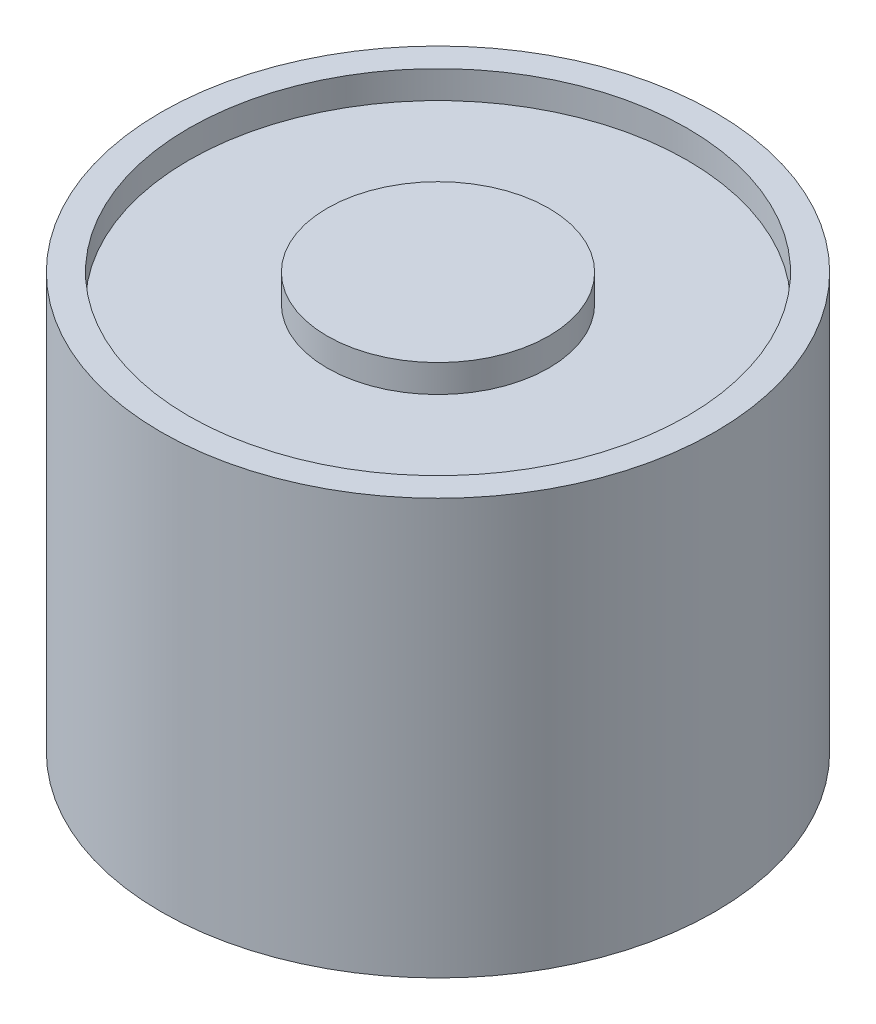
ISO-10303-21;
HEADER;
FILE_DESCRIPTION(('STEP AP214'),'2;1');
FILE_NAME('part.step','',(''),(''),'','','');
FILE_SCHEMA(('AUTOMOTIVE_DESIGN { 1 0 10303 214 1 1 1 1 }'));
ENDSEC;
DATA;
#1=APPLICATION_CONTEXT('core data for automotive mechanical design processes');
#2=APPLICATION_PROTOCOL_DEFINITION('international standard','automotive_design',2000,#1);
#3=PRODUCT_CONTEXT('',#1,'mechanical');
#4=PRODUCT('Part','Part','',(#3));
#5=PRODUCT_RELATED_PRODUCT_CATEGORY('part','',(#4));
#6=PRODUCT_DEFINITION_FORMATION('','',#4);
#7=PRODUCT_DEFINITION_CONTEXT('part definition',#1,'design');
#8=PRODUCT_DEFINITION('design','',#6,#7);
#9=PRODUCT_DEFINITION_SHAPE('','',#8);
#10=(LENGTH_UNIT() NAMED_UNIT(*) SI_UNIT(.MILLI.,.METRE.));
#11=(NAMED_UNIT(*) PLANE_ANGLE_UNIT() SI_UNIT($,.RADIAN.));
#12=(NAMED_UNIT(*) SI_UNIT($,.STERADIAN.) SOLID_ANGLE_UNIT());
#13=UNCERTAINTY_MEASURE_WITH_UNIT(LENGTH_MEASURE(1.E-05),#10,'distance_accuracy_value','');
#14=(GEOMETRIC_REPRESENTATION_CONTEXT(3) GLOBAL_UNCERTAINTY_ASSIGNED_CONTEXT((#13)) GLOBAL_UNIT_ASSIGNED_CONTEXT((#10,
#11,#12)) REPRESENTATION_CONTEXT('',''));
#15=CARTESIAN_POINT('',(0.,0.,0.));
#16=DIRECTION('',(0.,0.,1.));
#17=DIRECTION('',(1.,0.,0.));
#18=AXIS2_PLACEMENT_3D('',#15,#16,#17);
#19=CARTESIAN_POINT('',(0.,15.,0.));
#20=DIRECTION('',(0.,-1.,0.));
#21=DIRECTION('',(0.,0.,-1.));
#22=AXIS2_PLACEMENT_3D('',#19,#20,#21);
#23=CYLINDRICAL_SURFACE('',#22,10.);
#24=CARTESIAN_POINT('',(0.,15.,0.));
#25=DIRECTION('',(0.,1.,0.));
#26=DIRECTION('',(0.,0.,1.));
#27=AXIS2_PLACEMENT_3D('',#24,#25,#26);
#28=CIRCLE('',#27,10.);
#29=CARTESIAN_POINT('',(0.,15.,10.));
#30=VERTEX_POINT('',#29);
#31=EDGE_CURVE('E11',#30,#30,#28,.T.);
#32=ORIENTED_EDGE('',*,*,#31,.F.);
#33=EDGE_LOOP('',(#32));
#34=FACE_BOUND('',#33,.T.);
#35=CARTESIAN_POINT('',(0.,0.,0.));
#36=DIRECTION('',(0.,1.,0.));
#37=DIRECTION('',(0.,0.,1.));
#38=AXIS2_PLACEMENT_3D('',#35,#36,#37);
#39=CIRCLE('',#38,10.);
#40=CARTESIAN_POINT('',(0.,0.,10.));
#41=VERTEX_POINT('',#40);
#42=EDGE_CURVE('E37',#41,#41,#39,.T.);
#43=ORIENTED_EDGE('',*,*,#42,.T.);
#44=EDGE_LOOP('',(#43));
#45=FACE_BOUND('',#44,.T.);
#46=ADVANCED_FACE('F34',(#34,#45),#23,.T.);
#47=CARTESIAN_POINT('',(0.,15.,0.));
#48=DIRECTION('',(0.,1.,0.));
#49=DIRECTION('',(0.,0.,1.));
#50=AXIS2_PLACEMENT_3D('',#47,#48,#49);
#51=PLANE('',#50);
#52=CARTESIAN_POINT('',(0.,15.,0.));
#53=DIRECTION('',(0.,1.,0.));
#54=DIRECTION('',(0.,0.,1.));
#55=AXIS2_PLACEMENT_3D('',#52,#53,#54);
#56=CIRCLE('',#55,9.);
#57=CARTESIAN_POINT('',(0.,15.,9.));
#58=VERTEX_POINT('',#57);
#59=EDGE_CURVE('E63',#58,#58,#56,.T.);
#60=ORIENTED_EDGE('',*,*,#59,.F.);
#61=EDGE_LOOP('',(#60));
#62=FACE_BOUND('',#61,.T.);
#63=ORIENTED_EDGE('',*,*,#31,.T.);
#64=EDGE_LOOP('',(#63));
#65=FACE_BOUND('',#64,.T.);
#66=ADVANCED_FACE('F73',(#62,#65),#51,.T.);
#67=CARTESIAN_POINT('',(0.,0.,0.));
#68=DIRECTION('',(0.,1.,0.));
#69=DIRECTION('',(0.,0.,1.));
#70=AXIS2_PLACEMENT_3D('',#67,#68,#69);
#71=PLANE('',#70);
#72=CARTESIAN_POINT('',(0.,0.,0.));
#73=DIRECTION('',(0.,-1.,0.));
#74=DIRECTION('',(0.,0.,-1.));
#75=AXIS2_PLACEMENT_3D('',#72,#73,#74);
#76=CIRCLE('',#75,1.59999999999999);
#77=CARTESIAN_POINT('',(0.,0.,-1.59999999999999));
#78=VERTEX_POINT('',#77);
#79=EDGE_CURVE('E54',#78,#78,#76,.T.);
#80=ORIENTED_EDGE('',*,*,#79,.F.);
#81=EDGE_LOOP('',(#80));
#82=FACE_BOUND('',#81,.T.);
#83=ORIENTED_EDGE('',*,*,#42,.F.);
#84=EDGE_LOOP('',(#83));
#85=FACE_BOUND('',#84,.T.);
#86=ADVANCED_FACE('F76',(#82,#85),#71,.F.);
#87=CARTESIAN_POINT('',(0.,14.,0.));
#88=DIRECTION('',(0.,1.,0.));
#89=DIRECTION('',(0.,0.,1.));
#90=AXIS2_PLACEMENT_3D('',#87,#88,#89);
#91=CYLINDRICAL_SURFACE('',#90,9.);
#92=CARTESIAN_POINT('',(0.,14.,0.));
#93=DIRECTION('',(0.,1.,0.));
#94=DIRECTION('',(0.,0.,1.));
#95=AXIS2_PLACEMENT_3D('',#92,#93,#94);
#96=CIRCLE('',#95,9.);
#97=CARTESIAN_POINT('',(0.,14.,9.));
#98=VERTEX_POINT('',#97);
#99=EDGE_CURVE('E65',#98,#98,#96,.T.);
#100=ORIENTED_EDGE('',*,*,#99,.F.);
#101=EDGE_LOOP('',(#100));
#102=FACE_BOUND('',#101,.T.);
#103=ORIENTED_EDGE('',*,*,#59,.T.);
#104=EDGE_LOOP('',(#103));
#105=FACE_BOUND('',#104,.T.);
#106=ADVANCED_FACE('F71',(#102,#105),#91,.F.);
#107=CARTESIAN_POINT('',(0.,14.,0.));
#108=DIRECTION('',(0.,1.,0.));
#109=DIRECTION('',(0.,0.,1.));
#110=AXIS2_PLACEMENT_3D('',#107,#108,#109);
#111=PLANE('',#110);
#112=CARTESIAN_POINT('',(0.,14.,0.));
#113=DIRECTION('',(0.,1.,0.));
#114=DIRECTION('',(0.,0.,1.));
#115=AXIS2_PLACEMENT_3D('',#112,#113,#114);
#116=CIRCLE('',#115,4.);
#117=CARTESIAN_POINT('',(0.,14.,4.));
#118=VERTEX_POINT('',#117);
#119=EDGE_CURVE('E57',#118,#118,#116,.T.);
#120=ORIENTED_EDGE('',*,*,#119,.F.);
#121=EDGE_LOOP('',(#120));
#122=FACE_BOUND('',#121,.T.);
#123=ORIENTED_EDGE('',*,*,#99,.T.);
#124=EDGE_LOOP('',(#123));
#125=FACE_BOUND('',#124,.T.);
#126=ADVANCED_FACE('F90',(#122,#125),#111,.T.);
#127=CARTESIAN_POINT('',(0.,14.,0.));
#128=DIRECTION('',(0.,1.,0.));
#129=DIRECTION('',(0.,0.,1.));
#130=AXIS2_PLACEMENT_3D('',#127,#128,#129);
#131=CYLINDRICAL_SURFACE('',#130,4.);
#132=ORIENTED_EDGE('',*,*,#119,.T.);
#133=EDGE_LOOP('',(#132));
#134=FACE_BOUND('',#133,.T.);
#135=CARTESIAN_POINT('',(0.,15.,0.));
#136=DIRECTION('',(0.,1.,0.));
#137=DIRECTION('',(0.,0.,1.));
#138=AXIS2_PLACEMENT_3D('',#135,#136,#137);
#139=CIRCLE('',#138,4.);
#140=CARTESIAN_POINT('',(0.,15.,4.));
#141=VERTEX_POINT('',#140);
#142=EDGE_CURVE('E53',#141,#141,#139,.T.);
#143=ORIENTED_EDGE('',*,*,#142,.F.);
#144=EDGE_LOOP('',(#143));
#145=FACE_BOUND('',#144,.T.);
#146=ADVANCED_FACE('F97',(#134,#145),#131,.T.);
#147=ORIENTED_EDGE('',*,*,#142,.T.);
#148=EDGE_LOOP('',(#147));
#149=FACE_BOUND('',#148,.T.);
#150=ADVANCED_FACE('F47',(#149),#51,.T.);
#151=CARTESIAN_POINT('',(0.,5.,0.));
#152=DIRECTION('',(0.,-1.,0.));
#153=DIRECTION('',(0.,0.,-1.));
#154=AXIS2_PLACEMENT_3D('',#151,#152,#153);
#155=CONICAL_SURFACE('',#154,1.6,1.02974425867665);
#156=CARTESIAN_POINT('',(0.,5.9613769904441,0.));
#157=VERTEX_POINT('',#156);
#158=VERTEX_LOOP('',#157);
#159=FACE_BOUND('',#158,.T.);
#160=CARTESIAN_POINT('',(0.,5.,0.));
#161=DIRECTION('',(0.,-1.,0.));
#162=DIRECTION('',(0.,0.,-1.));
#163=AXIS2_PLACEMENT_3D('',#160,#161,#162);
#164=CIRCLE('',#163,1.6);
#165=CARTESIAN_POINT('',(0.,5.,-1.6));
#166=VERTEX_POINT('',#165);
#167=EDGE_CURVE('E51',#166,#166,#164,.T.);
#168=ORIENTED_EDGE('',*,*,#167,.T.);
#169=EDGE_LOOP('',(#168));
#170=FACE_BOUND('',#169,.T.);
#171=ADVANCED_FACE('F43',(#159,#170),#155,.F.);
#172=CARTESIAN_POINT('',(0.,0.,0.));
#173=DIRECTION('',(0.,-1.,0.));
#174=DIRECTION('',(0.,0.,-1.));
#175=AXIS2_PLACEMENT_3D('',#172,#173,#174);
#176=CYLINDRICAL_SURFACE('',#175,1.59999999999999);
#177=ORIENTED_EDGE('',*,*,#167,.F.);
#178=EDGE_LOOP('',(#177));
#179=FACE_BOUND('',#178,.T.);
#180=ORIENTED_EDGE('',*,*,#79,.T.);
#181=EDGE_LOOP('',(#180));
#182=FACE_BOUND('',#181,.T.);
#183=ADVANCED_FACE('F46',(#179,#182),#176,.F.);
#184=CLOSED_SHELL('',(#46,#66,#86,#106,#126,#146,#150,#171,#183));
#185=MANIFOLD_SOLID_BREP('B2',#184);
#186=ADVANCED_BREP_SHAPE_REPRESENTATION('',(#18,#185),#14);
#187=SHAPE_DEFINITION_REPRESENTATION(#9,#186);
ENDSEC;
END-ISO-10303-21;
